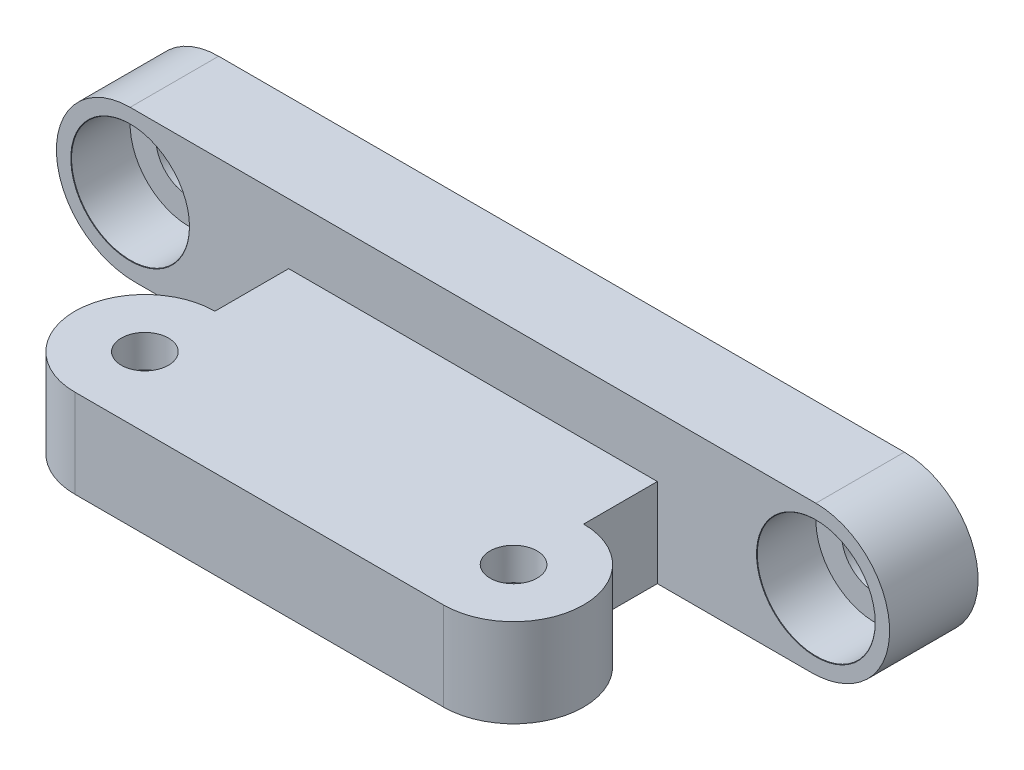
ISO-10303-21;
HEADER;
FILE_DESCRIPTION(('STEP AP214'),'2;1');
FILE_NAME('part.step','',(''),(''),'','','');
FILE_SCHEMA(('AUTOMOTIVE_DESIGN { 1 0 10303 214 1 1 1 1 }'));
ENDSEC;
DATA;
#1=APPLICATION_CONTEXT('core data for automotive mechanical design processes');
#2=APPLICATION_PROTOCOL_DEFINITION('international standard','automotive_design',2000,#1);
#3=PRODUCT_CONTEXT('',#1,'mechanical');
#4=PRODUCT('Part','Part','',(#3));
#5=PRODUCT_RELATED_PRODUCT_CATEGORY('part','',(#4));
#6=PRODUCT_DEFINITION_FORMATION('','',#4);
#7=PRODUCT_DEFINITION_CONTEXT('part definition',#1,'design');
#8=PRODUCT_DEFINITION('design','',#6,#7);
#9=PRODUCT_DEFINITION_SHAPE('','',#8);
#10=(LENGTH_UNIT() NAMED_UNIT(*) SI_UNIT(.MILLI.,.METRE.));
#11=(NAMED_UNIT(*) PLANE_ANGLE_UNIT() SI_UNIT($,.RADIAN.));
#12=(NAMED_UNIT(*) SI_UNIT($,.STERADIAN.) SOLID_ANGLE_UNIT());
#13=UNCERTAINTY_MEASURE_WITH_UNIT(LENGTH_MEASURE(1.E-05),#10,'distance_accuracy_value','');
#14=(GEOMETRIC_REPRESENTATION_CONTEXT(3) GLOBAL_UNCERTAINTY_ASSIGNED_CONTEXT((#13)) GLOBAL_UNIT_ASSIGNED_CONTEXT((#10,
#11,#12)) REPRESENTATION_CONTEXT('',''));
#15=CARTESIAN_POINT('',(0.,0.,0.));
#16=DIRECTION('',(0.,0.,1.));
#17=DIRECTION('',(1.,0.,0.));
#18=AXIS2_PLACEMENT_3D('',#15,#16,#17);
#19=CARTESIAN_POINT('',(12.5,-6.,0.));
#20=DIRECTION('',(0.,1.,0.));
#21=DIRECTION('',(0.,0.,1.));
#22=AXIS2_PLACEMENT_3D('',#19,#20,#21);
#23=CYLINDRICAL_SURFACE('',#22,4.75);
#24=CARTESIAN_POINT('',(12.5,0.,0.));
#25=DIRECTION('',(0.,1.,0.));
#26=DIRECTION('',(0.,0.,1.));
#27=AXIS2_PLACEMENT_3D('',#24,#25,#26);
#28=CIRCLE('',#27,4.75);
#29=CARTESIAN_POINT('',(12.5,0.,4.75));
#30=VERTEX_POINT('',#29);
#31=CARTESIAN_POINT('',(12.5,0.,-4.75));
#32=VERTEX_POINT('',#31);
#33=EDGE_CURVE('E122',#30,#32,#28,.T.);
#34=ORIENTED_EDGE('',*,*,#33,.F.);
#35=DIRECTION('',(0.,1.,0.));
#36=VECTOR('',#35,1.);
#37=CARTESIAN_POINT('',(12.5,-6.,4.75));
#38=LINE('',#37,#36);
#39=CARTESIAN_POINT('',(12.5,-6.,4.75));
#40=VERTEX_POINT('',#39);
#41=EDGE_CURVE('E11',#40,#30,#38,.T.);
#42=ORIENTED_EDGE('',*,*,#41,.F.);
#43=CARTESIAN_POINT('',(12.5,-6.,0.));
#44=DIRECTION('',(0.,1.,0.));
#45=DIRECTION('',(0.,0.,1.));
#46=AXIS2_PLACEMENT_3D('',#43,#44,#45);
#47=CIRCLE('',#46,4.75);
#48=CARTESIAN_POINT('',(12.5,-6.,-4.75));
#49=VERTEX_POINT('',#48);
#50=EDGE_CURVE('E117',#40,#49,#47,.T.);
#51=ORIENTED_EDGE('',*,*,#50,.T.);
#52=DIRECTION('',(0.,1.,0.));
#53=VECTOR('',#52,1.);
#54=CARTESIAN_POINT('',(12.5,-6.,-4.75));
#55=LINE('',#54,#53);
#56=EDGE_CURVE('E84',#49,#32,#55,.T.);
#57=ORIENTED_EDGE('',*,*,#56,.T.);
#58=EDGE_LOOP('',(#34,#42,#51,#57));
#59=FACE_BOUND('',#58,.T.);
#60=ADVANCED_FACE('F36',(#59),#23,.T.);
#61=CARTESIAN_POINT('',(-12.5,-6.,4.75));
#62=DIRECTION('',(0.,0.,1.));
#63=DIRECTION('',(1.,0.,0.));
#64=AXIS2_PLACEMENT_3D('',#61,#62,#63);
#65=PLANE('',#64);
#66=DIRECTION('',(1.,0.,0.));
#67=VECTOR('',#66,1.);
#68=CARTESIAN_POINT('',(-12.5,0.,4.75));
#69=LINE('',#68,#67);
#70=CARTESIAN_POINT('',(-12.5,0.,4.75));
#71=VERTEX_POINT('',#70);
#72=EDGE_CURVE('E135',#71,#30,#69,.T.);
#73=ORIENTED_EDGE('',*,*,#72,.F.);
#74=DIRECTION('',(0.,1.,0.));
#75=VECTOR('',#74,1.);
#76=CARTESIAN_POINT('',(-12.5,-6.,4.75));
#77=LINE('',#76,#75);
#78=CARTESIAN_POINT('',(-12.5,-6.,4.75));
#79=VERTEX_POINT('',#78);
#80=EDGE_CURVE('E45',#79,#71,#77,.T.);
#81=ORIENTED_EDGE('',*,*,#80,.F.);
#82=DIRECTION('',(1.,0.,0.));
#83=VECTOR('',#82,1.);
#84=CARTESIAN_POINT('',(-12.5,-6.,4.75));
#85=LINE('',#84,#83);
#86=EDGE_CURVE('E111',#79,#40,#85,.T.);
#87=ORIENTED_EDGE('',*,*,#86,.T.);
#88=ORIENTED_EDGE('',*,*,#41,.T.);
#89=EDGE_LOOP('',(#73,#81,#87,#88));
#90=FACE_BOUND('',#89,.T.);
#91=ADVANCED_FACE('F234',(#90),#65,.T.);
#92=CARTESIAN_POINT('',(-12.5,-6.,0.));
#93=DIRECTION('',(0.,1.,0.));
#94=DIRECTION('',(0.,0.,1.));
#95=AXIS2_PLACEMENT_3D('',#92,#93,#94);
#96=CYLINDRICAL_SURFACE('',#95,4.75);
#97=CARTESIAN_POINT('',(-12.5,0.,0.));
#98=DIRECTION('',(0.,1.,0.));
#99=DIRECTION('',(0.,0.,1.));
#100=AXIS2_PLACEMENT_3D('',#97,#98,#99);
#101=CIRCLE('',#100,4.75);
#102=CARTESIAN_POINT('',(-12.5,0.,-4.75));
#103=VERTEX_POINT('',#102);
#104=EDGE_CURVE('E98',#103,#71,#101,.T.);
#105=ORIENTED_EDGE('',*,*,#104,.F.);
#106=DIRECTION('',(0.,1.,0.));
#107=VECTOR('',#106,1.);
#108=CARTESIAN_POINT('',(-12.5,-6.,-4.75));
#109=LINE('',#108,#107);
#110=CARTESIAN_POINT('',(-12.5,-6.,-4.75));
#111=VERTEX_POINT('',#110);
#112=EDGE_CURVE('E93',#111,#103,#109,.T.);
#113=ORIENTED_EDGE('',*,*,#112,.F.);
#114=CARTESIAN_POINT('',(-12.5,-6.,0.));
#115=DIRECTION('',(0.,1.,0.));
#116=DIRECTION('',(0.,0.,1.));
#117=AXIS2_PLACEMENT_3D('',#114,#115,#116);
#118=CIRCLE('',#117,4.75);
#119=EDGE_CURVE('E96',#111,#79,#118,.T.);
#120=ORIENTED_EDGE('',*,*,#119,.T.);
#121=ORIENTED_EDGE('',*,*,#80,.T.);
#122=EDGE_LOOP('',(#105,#113,#120,#121));
#123=FACE_BOUND('',#122,.T.);
#124=ADVANCED_FACE('F95',(#123),#96,.T.);
#125=CARTESIAN_POINT('',(-12.5,-6.,-4.75));
#126=DIRECTION('',(-1.,0.,0.));
#127=DIRECTION('',(0.,0.,1.));
#128=AXIS2_PLACEMENT_3D('',#125,#126,#127);
#129=PLANE('',#128);
#130=DIRECTION('',(0.,0.,1.));
#131=VECTOR('',#130,1.);
#132=CARTESIAN_POINT('',(-12.5,0.,-4.75));
#133=LINE('',#132,#131);
#134=CARTESIAN_POINT('',(-12.5,0.,-9.75));
#135=VERTEX_POINT('',#134);
#136=EDGE_CURVE('E132',#135,#103,#133,.T.);
#137=ORIENTED_EDGE('',*,*,#136,.F.);
#138=DIRECTION('',(0.,1.,0.));
#139=VECTOR('',#138,1.);
#140=CARTESIAN_POINT('',(-12.5,-6.,-9.75));
#141=LINE('',#140,#139);
#142=CARTESIAN_POINT('',(-12.5,-6.,-9.75));
#143=VERTEX_POINT('',#142);
#144=EDGE_CURVE('E103',#143,#135,#141,.T.);
#145=ORIENTED_EDGE('',*,*,#144,.F.);
#146=DIRECTION('',(0.,0.,1.));
#147=VECTOR('',#146,1.);
#148=CARTESIAN_POINT('',(-12.5,-6.,-4.75));
#149=LINE('',#148,#147);
#150=EDGE_CURVE('E109',#143,#111,#149,.T.);
#151=ORIENTED_EDGE('',*,*,#150,.T.);
#152=ORIENTED_EDGE('',*,*,#112,.T.);
#153=EDGE_LOOP('',(#137,#145,#151,#152));
#154=FACE_BOUND('',#153,.T.);
#155=ADVANCED_FACE('F113',(#154),#129,.T.);
#156=CARTESIAN_POINT('',(12.5,-6.,-9.75));
#157=DIRECTION('',(1.,0.,0.));
#158=DIRECTION('',(0.,0.,-1.));
#159=AXIS2_PLACEMENT_3D('',#156,#157,#158);
#160=PLANE('',#159);
#161=DIRECTION('',(0.,0.,-1.));
#162=VECTOR('',#161,1.);
#163=CARTESIAN_POINT('',(12.5,0.,-9.75));
#164=LINE('',#163,#162);
#165=CARTESIAN_POINT('',(12.5,0.,-9.75));
#166=VERTEX_POINT('',#165);
#167=EDGE_CURVE('E125',#32,#166,#164,.T.);
#168=ORIENTED_EDGE('',*,*,#167,.F.);
#169=ORIENTED_EDGE('',*,*,#56,.F.);
#170=DIRECTION('',(0.,0.,-1.));
#171=VECTOR('',#170,1.);
#172=CARTESIAN_POINT('',(12.5,-6.,-9.75));
#173=LINE('',#172,#171);
#174=CARTESIAN_POINT('',(12.5,-6.,-9.75));
#175=VERTEX_POINT('',#174);
#176=EDGE_CURVE('E115',#49,#175,#173,.T.);
#177=ORIENTED_EDGE('',*,*,#176,.T.);
#178=DIRECTION('',(0.,1.,0.));
#179=VECTOR('',#178,1.);
#180=CARTESIAN_POINT('',(12.5,-6.,-9.75));
#181=LINE('',#180,#179);
#182=EDGE_CURVE('E140',#175,#166,#181,.T.);
#183=ORIENTED_EDGE('',*,*,#182,.T.);
#184=EDGE_LOOP('',(#168,#169,#177,#183));
#185=FACE_BOUND('',#184,.T.);
#186=ADVANCED_FACE('F285',(#185),#160,.T.);
#187=CARTESIAN_POINT('',(12.5,-6.,0.));
#188=DIRECTION('',(0.,1.,0.));
#189=DIRECTION('',(0.,0.,1.));
#190=AXIS2_PLACEMENT_3D('',#187,#188,#189);
#191=PLANE('',#190);
#192=CARTESIAN_POINT('',(-12.5,-6.,0.));
#193=DIRECTION('',(0.,1.,0.));
#194=DIRECTION('',(0.,0.,1.));
#195=AXIS2_PLACEMENT_3D('',#192,#193,#194);
#196=CIRCLE('',#195,2.75);
#197=CARTESIAN_POINT('',(-12.5,-6.,2.75));
#198=VERTEX_POINT('',#197);
#199=EDGE_CURVE('E221',#198,#198,#196,.T.);
#200=ORIENTED_EDGE('',*,*,#199,.T.);
#201=EDGE_LOOP('',(#200));
#202=FACE_BOUND('',#201,.T.);
#203=CARTESIAN_POINT('',(12.5,-6.,0.));
#204=DIRECTION('',(0.,1.,0.));
#205=DIRECTION('',(0.,0.,1.));
#206=AXIS2_PLACEMENT_3D('',#203,#204,#205);
#207=CIRCLE('',#206,2.75);
#208=CARTESIAN_POINT('',(12.5,-6.,2.75));
#209=VERTEX_POINT('',#208);
#210=EDGE_CURVE('E220',#209,#209,#207,.T.);
#211=ORIENTED_EDGE('',*,*,#210,.T.);
#212=EDGE_LOOP('',(#211));
#213=FACE_BOUND('',#212,.T.);
#214=ORIENTED_EDGE('',*,*,#50,.F.);
#215=ORIENTED_EDGE('',*,*,#86,.F.);
#216=ORIENTED_EDGE('',*,*,#119,.F.);
#217=ORIENTED_EDGE('',*,*,#150,.F.);
#218=DIRECTION('',(-1.,0.,0.));
#219=VECTOR('',#218,1.);
#220=CARTESIAN_POINT('',(-22.95,-5.99999999999999,-9.75));
#221=LINE('',#220,#219);
#222=CARTESIAN_POINT('',(-22.95,-5.99999999999999,-9.75));
#223=VERTEX_POINT('',#222);
#224=EDGE_CURVE('E200',#143,#223,#221,.T.);
#225=ORIENTED_EDGE('',*,*,#224,.T.);
#226=DIRECTION('',(0.,0.,1.));
#227=VECTOR('',#226,1.);
#228=CARTESIAN_POINT('',(-22.95,-5.99999999999999,-15.75));
#229=LINE('',#228,#227);
#230=CARTESIAN_POINT('',(-22.95,-5.99999999999999,-15.75));
#231=VERTEX_POINT('',#230);
#232=EDGE_CURVE('E187',#231,#223,#229,.T.);
#233=ORIENTED_EDGE('',*,*,#232,.F.);
#234=DIRECTION('',(-1.,0.,0.));
#235=VECTOR('',#234,1.);
#236=CARTESIAN_POINT('',(-22.95,-5.99999999999999,-15.75));
#237=LINE('',#236,#235);
#238=CARTESIAN_POINT('',(22.95,-6.,-15.75));
#239=VERTEX_POINT('',#238);
#240=EDGE_CURVE('E185',#239,#231,#237,.T.);
#241=ORIENTED_EDGE('',*,*,#240,.F.);
#242=DIRECTION('',(0.,0.,1.));
#243=VECTOR('',#242,1.);
#244=CARTESIAN_POINT('',(22.95,-6.,-15.75));
#245=LINE('',#244,#243);
#246=CARTESIAN_POINT('',(22.95,-6.,-9.75));
#247=VERTEX_POINT('',#246);
#248=EDGE_CURVE('E205',#239,#247,#245,.T.);
#249=ORIENTED_EDGE('',*,*,#248,.T.);
#250=EDGE_CURVE('E173',#247,#175,#221,.T.);
#251=ORIENTED_EDGE('',*,*,#250,.T.);
#252=ORIENTED_EDGE('',*,*,#176,.F.);
#253=EDGE_LOOP('',(#214,#215,#216,#217,#225,#233,#241,#249,#251,#252));
#254=FACE_BOUND('',#253,.T.);
#255=ADVANCED_FACE('F107',(#202,#213,#254),#191,.F.);
#256=CARTESIAN_POINT('',(12.5,0.,0.));
#257=DIRECTION('',(0.,1.,0.));
#258=DIRECTION('',(0.,0.,1.));
#259=AXIS2_PLACEMENT_3D('',#256,#257,#258);
#260=PLANE('',#259);
#261=CARTESIAN_POINT('',(-12.5,0.,0.));
#262=DIRECTION('',(0.,-1.,0.));
#263=DIRECTION('',(0.,0.,-1.));
#264=AXIS2_PLACEMENT_3D('',#261,#262,#263);
#265=CIRCLE('',#264,1.6);
#266=CARTESIAN_POINT('',(-12.5,0.,-1.6));
#267=VERTEX_POINT('',#266);
#268=EDGE_CURVE('E149',#267,#267,#265,.T.);
#269=ORIENTED_EDGE('',*,*,#268,.T.);
#270=EDGE_LOOP('',(#269));
#271=FACE_BOUND('',#270,.T.);
#272=CARTESIAN_POINT('',(12.5,0.,0.));
#273=DIRECTION('',(0.,-1.,0.));
#274=DIRECTION('',(0.,0.,-1.));
#275=AXIS2_PLACEMENT_3D('',#272,#273,#274);
#276=CIRCLE('',#275,1.6);
#277=CARTESIAN_POINT('',(12.5,0.,-1.6));
#278=VERTEX_POINT('',#277);
#279=EDGE_CURVE('E126',#278,#278,#276,.T.);
#280=ORIENTED_EDGE('',*,*,#279,.T.);
#281=EDGE_LOOP('',(#280));
#282=FACE_BOUND('',#281,.T.);
#283=ORIENTED_EDGE('',*,*,#33,.T.);
#284=ORIENTED_EDGE('',*,*,#167,.T.);
#285=DIRECTION('',(-1.,0.,0.));
#286=VECTOR('',#285,1.);
#287=CARTESIAN_POINT('',(-12.5,0.,-9.75));
#288=LINE('',#287,#286);
#289=EDGE_CURVE('E129',#166,#135,#288,.T.);
#290=ORIENTED_EDGE('',*,*,#289,.T.);
#291=ORIENTED_EDGE('',*,*,#136,.T.);
#292=ORIENTED_EDGE('',*,*,#104,.T.);
#293=ORIENTED_EDGE('',*,*,#72,.T.);
#294=EDGE_LOOP('',(#283,#284,#290,#291,#292,#293));
#295=FACE_BOUND('',#294,.T.);
#296=ADVANCED_FACE('F236',(#271,#282,#295),#260,.T.);
#297=CARTESIAN_POINT('',(12.5,-6.,0.));
#298=DIRECTION('',(0.,-1.,0.));
#299=DIRECTION('',(0.,0.,-1.));
#300=AXIS2_PLACEMENT_3D('',#297,#298,#299);
#301=CYLINDRICAL_SURFACE('',#300,1.6);
#302=CARTESIAN_POINT('',(12.5,-2.2,0.));
#303=DIRECTION('',(0.,1.,0.));
#304=DIRECTION('',(0.,0.,1.));
#305=AXIS2_PLACEMENT_3D('',#302,#303,#304);
#306=CIRCLE('',#305,1.6);
#307=CARTESIAN_POINT('',(12.5,-2.2,1.6));
#308=VERTEX_POINT('',#307);
#309=EDGE_CURVE('E146',#308,#308,#306,.F.);
#310=ORIENTED_EDGE('',*,*,#309,.T.);
#311=EDGE_LOOP('',(#310));
#312=FACE_BOUND('',#311,.T.);
#313=ORIENTED_EDGE('',*,*,#279,.F.);
#314=EDGE_LOOP('',(#313));
#315=FACE_BOUND('',#314,.T.);
#316=ADVANCED_FACE('F305',(#312,#315),#301,.F.);
#317=CARTESIAN_POINT('',(-12.5,-6.,0.));
#318=DIRECTION('',(0.,-1.,0.));
#319=DIRECTION('',(0.,0.,-1.));
#320=AXIS2_PLACEMENT_3D('',#317,#318,#319);
#321=CYLINDRICAL_SURFACE('',#320,1.6);
#322=CARTESIAN_POINT('',(-12.5,-2.2,0.));
#323=DIRECTION('',(0.,1.,0.));
#324=DIRECTION('',(0.,0.,1.));
#325=AXIS2_PLACEMENT_3D('',#322,#323,#324);
#326=CIRCLE('',#325,1.6);
#327=CARTESIAN_POINT('',(-12.5,-2.2,1.6));
#328=VERTEX_POINT('',#327);
#329=EDGE_CURVE('E143',#328,#328,#326,.F.);
#330=ORIENTED_EDGE('',*,*,#329,.T.);
#331=EDGE_LOOP('',(#330));
#332=FACE_BOUND('',#331,.T.);
#333=ORIENTED_EDGE('',*,*,#268,.F.);
#334=EDGE_LOOP('',(#333));
#335=FACE_BOUND('',#334,.T.);
#336=ADVANCED_FACE('F310',(#332,#335),#321,.F.);
#337=CARTESIAN_POINT('',(-12.5,-2.2,0.));
#338=DIRECTION('',(0.,1.,0.));
#339=DIRECTION('',(0.,0.,1.));
#340=AXIS2_PLACEMENT_3D('',#337,#338,#339);
#341=PLANE('',#340);
#342=CARTESIAN_POINT('',(-12.5,-2.2,0.));
#343=DIRECTION('',(0.,1.,0.));
#344=DIRECTION('',(0.,0.,1.));
#345=AXIS2_PLACEMENT_3D('',#342,#343,#344);
#346=CIRCLE('',#345,2.55085043872444);
#347=CARTESIAN_POINT('',(-12.5,-2.2,2.55085043872444));
#348=VERTEX_POINT('',#347);
#349=EDGE_CURVE('E147',#348,#348,#346,.T.);
#350=ORIENTED_EDGE('',*,*,#349,.F.);
#351=EDGE_LOOP('',(#350));
#352=FACE_BOUND('',#351,.T.);
#353=ORIENTED_EDGE('',*,*,#329,.F.);
#354=EDGE_LOOP('',(#353));
#355=FACE_BOUND('',#354,.T.);
#356=ADVANCED_FACE('F314',(#352,#355),#341,.F.);
#357=CARTESIAN_POINT('',(-12.5,-6.,0.));
#358=DIRECTION('',(0.,-1.,0.));
#359=DIRECTION('',(0.,0.,1.));
#360=AXIS2_PLACEMENT_3D('',#357,#358,#359);
#361=CONICAL_SURFACE('',#360,2.75,0.05235987755983);
#362=ORIENTED_EDGE('',*,*,#349,.T.);
#363=EDGE_LOOP('',(#362));
#364=FACE_BOUND('',#363,.T.);
#365=ORIENTED_EDGE('',*,*,#199,.F.);
#366=EDGE_LOOP('',(#365));
#367=FACE_BOUND('',#366,.T.);
#368=ADVANCED_FACE('F323',(#364,#367),#361,.F.);
#369=CARTESIAN_POINT('',(12.5,-2.2,0.));
#370=DIRECTION('',(0.,1.,0.));
#371=DIRECTION('',(0.,0.,1.));
#372=AXIS2_PLACEMENT_3D('',#369,#370,#371);
#373=PLANE('',#372);
#374=CARTESIAN_POINT('',(12.5,-2.2,0.));
#375=DIRECTION('',(0.,1.,0.));
#376=DIRECTION('',(0.,0.,1.));
#377=AXIS2_PLACEMENT_3D('',#374,#375,#376);
#378=CIRCLE('',#377,2.55085043872444);
#379=CARTESIAN_POINT('',(12.5,-2.2,2.55085043872444));
#380=VERTEX_POINT('',#379);
#381=EDGE_CURVE('E224',#380,#380,#378,.T.);
#382=ORIENTED_EDGE('',*,*,#381,.F.);
#383=EDGE_LOOP('',(#382));
#384=FACE_BOUND('',#383,.T.);
#385=ORIENTED_EDGE('',*,*,#309,.F.);
#386=EDGE_LOOP('',(#385));
#387=FACE_BOUND('',#386,.T.);
#388=ADVANCED_FACE('F319',(#384,#387),#373,.F.);
#389=CARTESIAN_POINT('',(12.5,-6.,0.));
#390=DIRECTION('',(0.,-1.,0.));
#391=DIRECTION('',(0.,0.,1.));
#392=AXIS2_PLACEMENT_3D('',#389,#390,#391);
#393=CONICAL_SURFACE('',#392,2.75,0.05235987755983);
#394=ORIENTED_EDGE('',*,*,#381,.T.);
#395=EDGE_LOOP('',(#394));
#396=FACE_BOUND('',#395,.T.);
#397=ORIENTED_EDGE('',*,*,#210,.F.);
#398=EDGE_LOOP('',(#397));
#399=FACE_BOUND('',#398,.T.);
#400=ADVANCED_FACE('F316',(#396,#399),#393,.F.);
#401=CARTESIAN_POINT('',(-22.95,-0.5,-15.75));
#402=DIRECTION('',(0.,0.,1.));
#403=DIRECTION('',(1.,0.,0.));
#404=AXIS2_PLACEMENT_3D('',#401,#402,#403);
#405=CYLINDRICAL_SURFACE('',#404,5.49999999999999);
#406=CARTESIAN_POINT('',(-22.95,-0.5,-9.75));
#407=DIRECTION('',(0.,0.,-1.));
#408=DIRECTION('',(-1.,0.,0.));
#409=AXIS2_PLACEMENT_3D('',#406,#407,#408);
#410=CIRCLE('',#409,5.49999999999999);
#411=CARTESIAN_POINT('',(-26.25,-4.89999999999996,-9.75));
#412=VERTEX_POINT('',#411);
#413=EDGE_CURVE('E152',#223,#412,#410,.T.);
#414=ORIENTED_EDGE('',*,*,#413,.T.);
#415=DIRECTION('',(0.,0.,1.));
#416=VECTOR('',#415,1.);
#417=CARTESIAN_POINT('',(-26.25,-4.89999999999996,-15.75));
#418=LINE('',#417,#416);
#419=CARTESIAN_POINT('',(-26.25,-4.89999999999996,-15.75));
#420=VERTEX_POINT('',#419);
#421=EDGE_CURVE('E217',#420,#412,#418,.T.);
#422=ORIENTED_EDGE('',*,*,#421,.F.);
#423=CARTESIAN_POINT('',(-22.95,-0.5,-15.75));
#424=DIRECTION('',(0.,0.,-1.));
#425=DIRECTION('',(-1.,0.,0.));
#426=AXIS2_PLACEMENT_3D('',#423,#424,#425);
#427=CIRCLE('',#426,5.49999999999999);
#428=EDGE_CURVE('E169',#231,#420,#427,.T.);
#429=ORIENTED_EDGE('',*,*,#428,.F.);
#430=ORIENTED_EDGE('',*,*,#232,.T.);
#431=EDGE_LOOP('',(#414,#422,#429,#430));
#432=FACE_BOUND('',#431,.T.);
#433=ADVANCED_FACE('F251',(#432),#405,.T.);
#434=CARTESIAN_POINT('',(-23.25,-0.899999999999997,-15.75));
#435=DIRECTION('',(0.,0.,1.));
#436=DIRECTION('',(1.,0.,0.));
#437=AXIS2_PLACEMENT_3D('',#434,#435,#436);
#438=CYLINDRICAL_SURFACE('',#437,4.99999999999999);
#439=CARTESIAN_POINT('',(-23.25,-0.899999999999997,-9.75));
#440=DIRECTION('',(0.,0.,-1.));
#441=DIRECTION('',(-1.,0.,0.));
#442=AXIS2_PLACEMENT_3D('',#439,#440,#441);
#443=CIRCLE('',#442,4.99999999999999);
#444=CARTESIAN_POINT('',(-23.25,4.1,-9.75));
#445=VERTEX_POINT('',#444);
#446=EDGE_CURVE('E157',#412,#445,#443,.T.);
#447=ORIENTED_EDGE('',*,*,#446,.T.);
#448=DIRECTION('',(0.,0.,1.));
#449=VECTOR('',#448,1.);
#450=CARTESIAN_POINT('',(-23.25,4.1,-15.75));
#451=LINE('',#450,#449);
#452=CARTESIAN_POINT('',(-23.25,4.1,-15.75));
#453=VERTEX_POINT('',#452);
#454=EDGE_CURVE('E214',#453,#445,#451,.T.);
#455=ORIENTED_EDGE('',*,*,#454,.F.);
#456=CARTESIAN_POINT('',(-23.25,-0.899999999999997,-15.75));
#457=DIRECTION('',(0.,0.,-1.));
#458=DIRECTION('',(-1.,0.,0.));
#459=AXIS2_PLACEMENT_3D('',#456,#457,#458);
#460=CIRCLE('',#459,4.99999999999999);
#461=EDGE_CURVE('E172',#420,#453,#460,.T.);
#462=ORIENTED_EDGE('',*,*,#461,.F.);
#463=ORIENTED_EDGE('',*,*,#421,.T.);
#464=EDGE_LOOP('',(#447,#455,#462,#463));
#465=FACE_BOUND('',#464,.T.);
#466=ADVANCED_FACE('F333',(#465),#438,.T.);
#467=CARTESIAN_POINT('',(-23.25,4.1,-15.75));
#468=DIRECTION('',(0.,-1.,0.));
#469=DIRECTION('',(1.,0.,0.));
#470=AXIS2_PLACEMENT_3D('',#467,#468,#469);
#471=PLANE('',#470);
#472=DIRECTION('',(1.,0.,0.));
#473=VECTOR('',#472,1.);
#474=CARTESIAN_POINT('',(-23.25,4.1,-9.75));
#475=LINE('',#474,#473);
#476=CARTESIAN_POINT('',(23.25,4.09999999999998,-9.75));
#477=VERTEX_POINT('',#476);
#478=EDGE_CURVE('E191',#445,#477,#475,.T.);
#479=ORIENTED_EDGE('',*,*,#478,.T.);
#480=DIRECTION('',(0.,0.,1.));
#481=VECTOR('',#480,1.);
#482=CARTESIAN_POINT('',(23.25,4.09999999999998,-15.75));
#483=LINE('',#482,#481);
#484=CARTESIAN_POINT('',(23.25,4.09999999999998,-15.75));
#485=VERTEX_POINT('',#484);
#486=EDGE_CURVE('E211',#485,#477,#483,.T.);
#487=ORIENTED_EDGE('',*,*,#486,.F.);
#488=DIRECTION('',(1.,0.,0.));
#489=VECTOR('',#488,1.);
#490=CARTESIAN_POINT('',(-23.25,4.1,-15.75));
#491=LINE('',#490,#489);
#492=EDGE_CURVE('E176',#453,#485,#491,.T.);
#493=ORIENTED_EDGE('',*,*,#492,.F.);
#494=ORIENTED_EDGE('',*,*,#454,.T.);
#495=EDGE_LOOP('',(#479,#487,#493,#494));
#496=FACE_BOUND('',#495,.T.);
#497=ADVANCED_FACE('F336',(#496),#471,.F.);
#498=CARTESIAN_POINT('',(23.25,-0.900000000000003,-15.75));
#499=DIRECTION('',(0.,0.,1.));
#500=DIRECTION('',(1.,0.,0.));
#501=AXIS2_PLACEMENT_3D('',#498,#499,#500);
#502=CYLINDRICAL_SURFACE('',#501,4.99999999999999);
#503=CARTESIAN_POINT('',(23.25,-0.900000000000003,-9.75));
#504=DIRECTION('',(0.,0.,-1.));
#505=DIRECTION('',(1.,0.,0.));
#506=AXIS2_PLACEMENT_3D('',#503,#504,#505);
#507=CIRCLE('',#506,4.99999999999999);
#508=CARTESIAN_POINT('',(26.25,-4.89999999999997,-9.75));
#509=VERTEX_POINT('',#508);
#510=EDGE_CURVE('E194',#477,#509,#507,.T.);
#511=ORIENTED_EDGE('',*,*,#510,.T.);
#512=DIRECTION('',(0.,0.,1.));
#513=VECTOR('',#512,1.);
#514=CARTESIAN_POINT('',(26.25,-4.89999999999997,-15.75));
#515=LINE('',#514,#513);
#516=CARTESIAN_POINT('',(26.25,-4.89999999999997,-15.75));
#517=VERTEX_POINT('',#516);
#518=EDGE_CURVE('E208',#517,#509,#515,.T.);
#519=ORIENTED_EDGE('',*,*,#518,.F.);
#520=CARTESIAN_POINT('',(23.25,-0.900000000000003,-15.75));
#521=DIRECTION('',(0.,0.,-1.));
#522=DIRECTION('',(1.,0.,0.));
#523=AXIS2_PLACEMENT_3D('',#520,#521,#522);
#524=CIRCLE('',#523,4.99999999999999);
#525=EDGE_CURVE('E179',#485,#517,#524,.T.);
#526=ORIENTED_EDGE('',*,*,#525,.F.);
#527=ORIENTED_EDGE('',*,*,#486,.T.);
#528=EDGE_LOOP('',(#511,#519,#526,#527));
#529=FACE_BOUND('',#528,.T.);
#530=ADVANCED_FACE('F339',(#529),#502,.T.);
#531=CARTESIAN_POINT('',(22.95,-0.500000000000006,-15.75));
#532=DIRECTION('',(0.,0.,1.));
#533=DIRECTION('',(1.,0.,0.));
#534=AXIS2_PLACEMENT_3D('',#531,#532,#533);
#535=CYLINDRICAL_SURFACE('',#534,5.49999999999999);
#536=CARTESIAN_POINT('',(22.95,-0.500000000000006,-9.75));
#537=DIRECTION('',(0.,0.,-1.));
#538=DIRECTION('',(1.,0.,0.));
#539=AXIS2_PLACEMENT_3D('',#536,#537,#538);
#540=CIRCLE('',#539,5.49999999999999);
#541=EDGE_CURVE('E197',#509,#247,#540,.T.);
#542=ORIENTED_EDGE('',*,*,#541,.T.);
#543=ORIENTED_EDGE('',*,*,#248,.F.);
#544=CARTESIAN_POINT('',(22.95,-0.500000000000006,-15.75));
#545=DIRECTION('',(0.,0.,-1.));
#546=DIRECTION('',(1.,0.,0.));
#547=AXIS2_PLACEMENT_3D('',#544,#545,#546);
#548=CIRCLE('',#547,5.49999999999999);
#549=EDGE_CURVE('E182',#517,#239,#548,.T.);
#550=ORIENTED_EDGE('',*,*,#549,.F.);
#551=ORIENTED_EDGE('',*,*,#518,.T.);
#552=EDGE_LOOP('',(#542,#543,#550,#551));
#553=FACE_BOUND('',#552,.T.);
#554=ADVANCED_FACE('F280',(#553),#535,.T.);
#555=CARTESIAN_POINT('',(-22.95,-0.5,-15.75));
#556=DIRECTION('',(0.,0.,-1.));
#557=DIRECTION('',(-1.,0.,0.));
#558=AXIS2_PLACEMENT_3D('',#555,#556,#557);
#559=PLANE('',#558);
#560=CARTESIAN_POINT('',(23.25,-0.900000000000003,-15.75));
#561=DIRECTION('',(0.,0.,-1.));
#562=DIRECTION('',(-1.,0.,0.));
#563=AXIS2_PLACEMENT_3D('',#560,#561,#562);
#564=CIRCLE('',#563,2.25);
#565=CARTESIAN_POINT('',(21.,-0.900000000000003,-15.75));
#566=VERTEX_POINT('',#565);
#567=EDGE_CURVE('E39',#566,#566,#564,.T.);
#568=ORIENTED_EDGE('',*,*,#567,.F.);
#569=EDGE_LOOP('',(#568));
#570=FACE_BOUND('',#569,.T.);
#571=CARTESIAN_POINT('',(-23.25,-0.899999999999997,-15.75));
#572=DIRECTION('',(0.,0.,-1.));
#573=DIRECTION('',(-1.,0.,0.));
#574=AXIS2_PLACEMENT_3D('',#571,#572,#573);
#575=CIRCLE('',#574,2.25);
#576=CARTESIAN_POINT('',(-25.5,-0.899999999999997,-15.75));
#577=VERTEX_POINT('',#576);
#578=EDGE_CURVE('E150',#577,#577,#575,.T.);
#579=ORIENTED_EDGE('',*,*,#578,.F.);
#580=EDGE_LOOP('',(#579));
#581=FACE_BOUND('',#580,.T.);
#582=ORIENTED_EDGE('',*,*,#428,.T.);
#583=ORIENTED_EDGE('',*,*,#461,.T.);
#584=ORIENTED_EDGE('',*,*,#492,.T.);
#585=ORIENTED_EDGE('',*,*,#525,.T.);
#586=ORIENTED_EDGE('',*,*,#549,.T.);
#587=ORIENTED_EDGE('',*,*,#240,.T.);
#588=EDGE_LOOP('',(#582,#583,#584,#585,#586,#587));
#589=FACE_BOUND('',#588,.T.);
#590=ADVANCED_FACE('F257',(#570,#581,#589),#559,.T.);
#591=CARTESIAN_POINT('',(-22.95,-0.5,-9.75));
#592=DIRECTION('',(0.,0.,-1.));
#593=DIRECTION('',(-1.,0.,0.));
#594=AXIS2_PLACEMENT_3D('',#591,#592,#593);
#595=PLANE('',#594);
#596=CARTESIAN_POINT('',(23.25,-0.900000000000003,-9.75));
#597=DIRECTION('',(0.,0.,1.));
#598=DIRECTION('',(1.,0.,0.));
#599=AXIS2_PLACEMENT_3D('',#596,#597,#598);
#600=CIRCLE('',#599,4.025);
#601=CARTESIAN_POINT('',(27.275,-0.900000000000003,-9.75));
#602=VERTEX_POINT('',#601);
#603=EDGE_CURVE('E390',#602,#602,#600,.T.);
#604=ORIENTED_EDGE('',*,*,#603,.F.);
#605=EDGE_LOOP('',(#604));
#606=FACE_BOUND('',#605,.T.);
#607=CARTESIAN_POINT('',(-23.25,-0.899999999999997,-9.75));
#608=DIRECTION('',(0.,0.,1.));
#609=DIRECTION('',(1.,0.,0.));
#610=AXIS2_PLACEMENT_3D('',#607,#608,#609);
#611=CIRCLE('',#610,4.025);
#612=CARTESIAN_POINT('',(-19.225,-0.899999999999997,-9.75));
#613=VERTEX_POINT('',#612);
#614=EDGE_CURVE('E400',#613,#613,#611,.T.);
#615=ORIENTED_EDGE('',*,*,#614,.F.);
#616=EDGE_LOOP('',(#615));
#617=FACE_BOUND('',#616,.T.);
#618=ORIENTED_EDGE('',*,*,#182,.F.);
#619=ORIENTED_EDGE('',*,*,#250,.F.);
#620=ORIENTED_EDGE('',*,*,#541,.F.);
#621=ORIENTED_EDGE('',*,*,#510,.F.);
#622=ORIENTED_EDGE('',*,*,#478,.F.);
#623=ORIENTED_EDGE('',*,*,#446,.F.);
#624=ORIENTED_EDGE('',*,*,#413,.F.);
#625=ORIENTED_EDGE('',*,*,#224,.F.);
#626=ORIENTED_EDGE('',*,*,#144,.T.);
#627=ORIENTED_EDGE('',*,*,#289,.F.);
#628=EDGE_LOOP('',(#618,#619,#620,#621,#622,#623,#624,#625,#626,#627));
#629=FACE_BOUND('',#628,.T.);
#630=ADVANCED_FACE('F241',(#606,#617,#629),#595,.F.);
#631=CARTESIAN_POINT('',(-23.25,-0.899999999999997,-9.75));
#632=DIRECTION('',(0.,0.,1.));
#633=DIRECTION('',(1.,0.,0.));
#634=AXIS2_PLACEMENT_3D('',#631,#632,#633);
#635=CYLINDRICAL_SURFACE('',#634,2.25);
#636=ORIENTED_EDGE('',*,*,#578,.T.);
#637=EDGE_LOOP('',(#636));
#638=FACE_BOUND('',#637,.T.);
#639=CARTESIAN_POINT('',(-23.25,-0.899999999999997,-13.75));
#640=DIRECTION('',(0.,0.,1.));
#641=DIRECTION('',(1.,0.,0.));
#642=AXIS2_PLACEMENT_3D('',#639,#640,#641);
#643=CIRCLE('',#642,2.25);
#644=CARTESIAN_POINT('',(-21.,-0.899999999999997,-13.75));
#645=VERTEX_POINT('',#644);
#646=EDGE_CURVE('E153',#645,#645,#643,.T.);
#647=ORIENTED_EDGE('',*,*,#646,.T.);
#648=EDGE_LOOP('',(#647));
#649=FACE_BOUND('',#648,.T.);
#650=ADVANCED_FACE('F348',(#638,#649),#635,.F.);
#651=CARTESIAN_POINT('',(-21.,-0.899999999999997,-13.75));
#652=DIRECTION('',(0.,0.,-1.));
#653=DIRECTION('',(-1.,0.,0.));
#654=AXIS2_PLACEMENT_3D('',#651,#652,#653);
#655=PLANE('',#654);
#656=ORIENTED_EDGE('',*,*,#646,.F.);
#657=EDGE_LOOP('',(#656));
#658=FACE_BOUND('',#657,.T.);
#659=CARTESIAN_POINT('',(-23.25,-0.899999999999997,-13.75));
#660=DIRECTION('',(0.,0.,1.));
#661=DIRECTION('',(1.,0.,0.));
#662=AXIS2_PLACEMENT_3D('',#659,#660,#661);
#663=CIRCLE('',#662,4.);
#664=CARTESIAN_POINT('',(-19.25,-0.899999999999997,-13.75));
#665=VERTEX_POINT('',#664);
#666=EDGE_CURVE('E160',#665,#665,#663,.T.);
#667=ORIENTED_EDGE('',*,*,#666,.T.);
#668=EDGE_LOOP('',(#667));
#669=FACE_BOUND('',#668,.T.);
#670=ADVANCED_FACE('F355',(#658,#669),#655,.F.);
#671=CARTESIAN_POINT('',(-23.25,-0.899999999999997,-9.75));
#672=DIRECTION('',(0.,0.,1.));
#673=DIRECTION('',(1.,0.,0.));
#674=AXIS2_PLACEMENT_3D('',#671,#672,#673);
#675=CYLINDRICAL_SURFACE('',#674,4.);
#676=ORIENTED_EDGE('',*,*,#666,.F.);
#677=EDGE_LOOP('',(#676));
#678=FACE_BOUND('',#677,.T.);
#679=CARTESIAN_POINT('',(-23.25,-0.899999999999997,-9.775));
#680=DIRECTION('',(0.,0.,1.));
#681=DIRECTION('',(1.,0.,0.));
#682=AXIS2_PLACEMENT_3D('',#679,#680,#681);
#683=CIRCLE('',#682,4.);
#684=CARTESIAN_POINT('',(-19.25,-0.899999999999997,-9.775));
#685=VERTEX_POINT('',#684);
#686=EDGE_CURVE('E165',#685,#685,#683,.T.);
#687=ORIENTED_EDGE('',*,*,#686,.T.);
#688=EDGE_LOOP('',(#687));
#689=FACE_BOUND('',#688,.T.);
#690=ADVANCED_FACE('F358',(#678,#689),#675,.F.);
#691=CARTESIAN_POINT('',(-23.25,-0.899999999999997,-9.75));
#692=DIRECTION('',(0.,0.,1.));
#693=DIRECTION('',(1.,0.,0.));
#694=AXIS2_PLACEMENT_3D('',#691,#692,#693);
#695=CONICAL_SURFACE('',#694,4.025,0.785398163397414);
#696=ORIENTED_EDGE('',*,*,#686,.F.);
#697=EDGE_LOOP('',(#696));
#698=FACE_BOUND('',#697,.T.);
#699=ORIENTED_EDGE('',*,*,#614,.T.);
#700=EDGE_LOOP('',(#699));
#701=FACE_BOUND('',#700,.T.);
#702=ADVANCED_FACE('F362',(#698,#701),#695,.F.);
#703=CARTESIAN_POINT('',(23.25,-0.900000000000003,-9.75));
#704=DIRECTION('',(0.,0.,1.));
#705=DIRECTION('',(1.,0.,0.));
#706=AXIS2_PLACEMENT_3D('',#703,#704,#705);
#707=CYLINDRICAL_SURFACE('',#706,2.25);
#708=ORIENTED_EDGE('',*,*,#567,.T.);
#709=EDGE_LOOP('',(#708));
#710=FACE_BOUND('',#709,.T.);
#711=CARTESIAN_POINT('',(23.25,-0.900000000000003,-13.75));
#712=DIRECTION('',(0.,0.,1.));
#713=DIRECTION('',(1.,0.,0.));
#714=AXIS2_PLACEMENT_3D('',#711,#712,#713);
#715=CIRCLE('',#714,2.25);
#716=CARTESIAN_POINT('',(25.5,-0.900000000000003,-13.75));
#717=VERTEX_POINT('',#716);
#718=EDGE_CURVE('E397',#717,#717,#715,.T.);
#719=ORIENTED_EDGE('',*,*,#718,.T.);
#720=EDGE_LOOP('',(#719));
#721=FACE_BOUND('',#720,.T.);
#722=ADVANCED_FACE('F366',(#710,#721),#707,.F.);
#723=CARTESIAN_POINT('',(25.5,-0.900000000000003,-13.75));
#724=DIRECTION('',(0.,0.,-1.));
#725=DIRECTION('',(-1.,0.,0.));
#726=AXIS2_PLACEMENT_3D('',#723,#724,#725);
#727=PLANE('',#726);
#728=ORIENTED_EDGE('',*,*,#718,.F.);
#729=EDGE_LOOP('',(#728));
#730=FACE_BOUND('',#729,.T.);
#731=CARTESIAN_POINT('',(23.25,-0.900000000000003,-13.75));
#732=DIRECTION('',(0.,0.,1.));
#733=DIRECTION('',(1.,0.,0.));
#734=AXIS2_PLACEMENT_3D('',#731,#732,#733);
#735=CIRCLE('',#734,4.);
#736=CARTESIAN_POINT('',(27.25,-0.900000000000003,-13.75));
#737=VERTEX_POINT('',#736);
#738=EDGE_CURVE('E392',#737,#737,#735,.T.);
#739=ORIENTED_EDGE('',*,*,#738,.T.);
#740=EDGE_LOOP('',(#739));
#741=FACE_BOUND('',#740,.T.);
#742=ADVANCED_FACE('F370',(#730,#741),#727,.F.);
#743=CARTESIAN_POINT('',(23.25,-0.900000000000003,-9.75));
#744=DIRECTION('',(0.,0.,1.));
#745=DIRECTION('',(1.,0.,0.));
#746=AXIS2_PLACEMENT_3D('',#743,#744,#745);
#747=CYLINDRICAL_SURFACE('',#746,4.);
#748=ORIENTED_EDGE('',*,*,#738,.F.);
#749=EDGE_LOOP('',(#748));
#750=FACE_BOUND('',#749,.T.);
#751=CARTESIAN_POINT('',(23.25,-0.900000000000003,-9.775));
#752=DIRECTION('',(0.,0.,1.));
#753=DIRECTION('',(1.,0.,0.));
#754=AXIS2_PLACEMENT_3D('',#751,#752,#753);
#755=CIRCLE('',#754,4.);
#756=CARTESIAN_POINT('',(27.25,-0.900000000000003,-9.775));
#757=VERTEX_POINT('',#756);
#758=EDGE_CURVE('E387',#757,#757,#755,.T.);
#759=ORIENTED_EDGE('',*,*,#758,.T.);
#760=EDGE_LOOP('',(#759));
#761=FACE_BOUND('',#760,.T.);
#762=ADVANCED_FACE('F374',(#750,#761),#747,.F.);
#763=CARTESIAN_POINT('',(23.25,-0.900000000000003,-9.75));
#764=DIRECTION('',(0.,0.,1.));
#765=DIRECTION('',(1.,0.,0.));
#766=AXIS2_PLACEMENT_3D('',#763,#764,#765);
#767=CONICAL_SURFACE('',#766,4.025,0.785398163397414);
#768=ORIENTED_EDGE('',*,*,#758,.F.);
#769=EDGE_LOOP('',(#768));
#770=FACE_BOUND('',#769,.T.);
#771=ORIENTED_EDGE('',*,*,#603,.T.);
#772=EDGE_LOOP('',(#771));
#773=FACE_BOUND('',#772,.T.);
#774=ADVANCED_FACE('F378',(#770,#773),#767,.F.);
#775=CLOSED_SHELL('',(#60,#91,#124,#155,#186,#255,#296,#316,#336,#356,#368,#388,#400,#433,#466,
#497,#530,#554,#590,#630,#650,#670,#690,#702,#722,#742,#762,#774));
#776=MANIFOLD_SOLID_BREP('B2',#775);
#777=ADVANCED_BREP_SHAPE_REPRESENTATION('',(#18,#776),#14);
#778=SHAPE_DEFINITION_REPRESENTATION(#9,#777);
ENDSEC;
END-ISO-10303-21;
